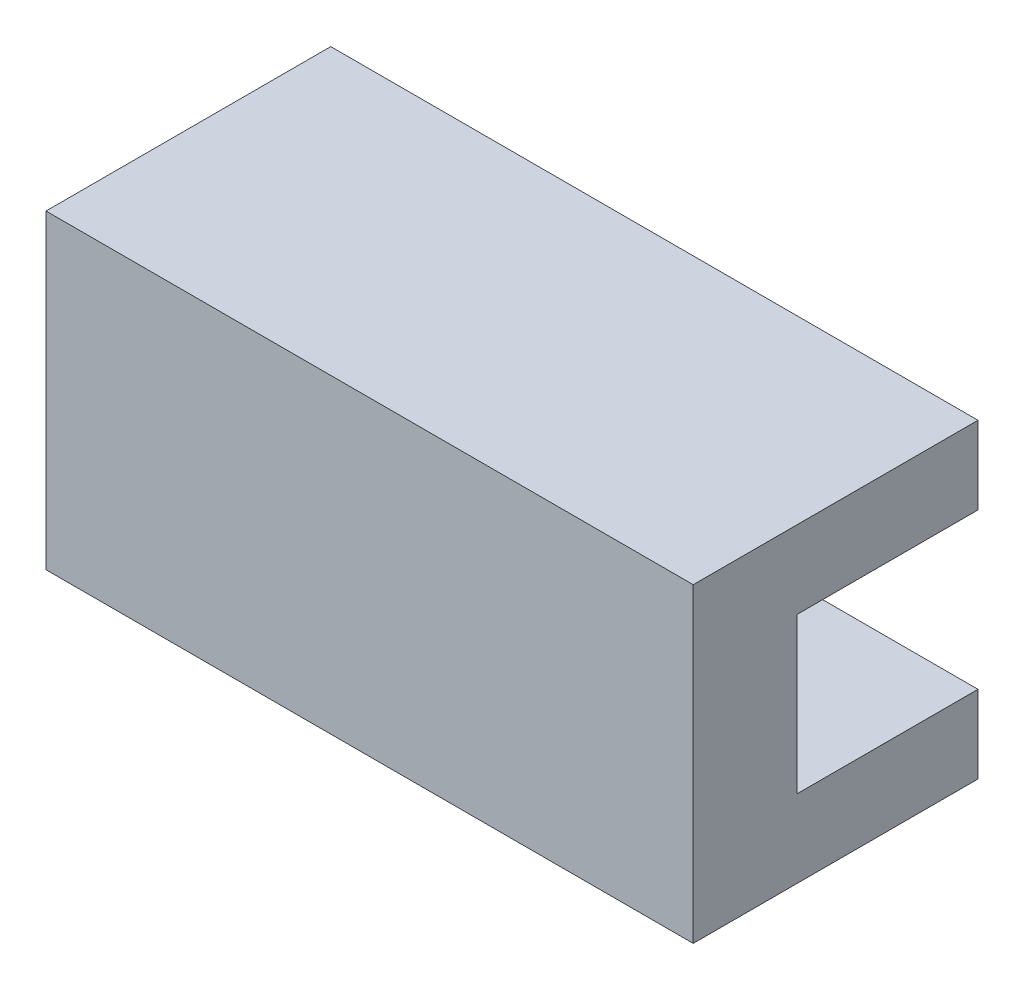
ISO-10303-21;
HEADER;
FILE_DESCRIPTION(('STEP AP214'),'2;1');
FILE_NAME('part.step','',(''),(''),'','','');
FILE_SCHEMA(('AUTOMOTIVE_DESIGN { 1 0 10303 214 1 1 1 1 }'));
ENDSEC;
DATA;
#1=APPLICATION_CONTEXT('core data for automotive mechanical design processes');
#2=APPLICATION_PROTOCOL_DEFINITION('international standard','automotive_design',2000,#1);
#3=PRODUCT_CONTEXT('',#1,'mechanical');
#4=PRODUCT('Part','Part','',(#3));
#5=PRODUCT_RELATED_PRODUCT_CATEGORY('part','',(#4));
#6=PRODUCT_DEFINITION_FORMATION('','',#4);
#7=PRODUCT_DEFINITION_CONTEXT('part definition',#1,'design');
#8=PRODUCT_DEFINITION('design','',#6,#7);
#9=PRODUCT_DEFINITION_SHAPE('','',#8);
#10=(LENGTH_UNIT() NAMED_UNIT(*) SI_UNIT(.MILLI.,.METRE.));
#11=(NAMED_UNIT(*) PLANE_ANGLE_UNIT() SI_UNIT($,.RADIAN.));
#12=(NAMED_UNIT(*) SI_UNIT($,.STERADIAN.) SOLID_ANGLE_UNIT());
#13=UNCERTAINTY_MEASURE_WITH_UNIT(LENGTH_MEASURE(1.E-05),#10,'distance_accuracy_value','');
#14=(GEOMETRIC_REPRESENTATION_CONTEXT(3) GLOBAL_UNCERTAINTY_ASSIGNED_CONTEXT((#13)) GLOBAL_UNIT_ASSIGNED_CONTEXT((#10,
#11,#12)) REPRESENTATION_CONTEXT('',''));
#15=CARTESIAN_POINT('',(0.,0.,0.));
#16=DIRECTION('',(0.,0.,1.));
#17=DIRECTION('',(1.,0.,0.));
#18=AXIS2_PLACEMENT_3D('',#15,#16,#17);
#19=CARTESIAN_POINT('',(50.,13.6272988505747,-24.8818965517241));
#20=DIRECTION('',(0.,0.,1.));
#21=DIRECTION('',(1.,0.,0.));
#22=AXIS2_PLACEMENT_3D('',#19,#20,#21);
#23=PLANE('',#22);
#24=DIRECTION('',(0.,1.,0.));
#25=VECTOR('',#24,1.);
#26=CARTESIAN_POINT('',(0.,13.6272988505747,-24.8818965517241));
#27=LINE('',#26,#25);
#28=CARTESIAN_POINT('',(0.,13.6272988505747,-24.8818965517241));
#29=VERTEX_POINT('',#28);
#30=CARTESIAN_POINT('',(0.,19.6272988505747,-24.8818965517241));
#31=VERTEX_POINT('',#30);
#32=EDGE_CURVE('E127',#29,#31,#27,.T.);
#33=ORIENTED_EDGE('',*,*,#32,.T.);
#34=DIRECTION('',(-1.,0.,0.));
#35=VECTOR('',#34,1.);
#36=CARTESIAN_POINT('',(50.,19.6272988505747,-24.8818965517241));
#37=LINE('',#36,#35);
#38=CARTESIAN_POINT('',(50.,19.6272988505747,-24.8818965517241));
#39=VERTEX_POINT('',#38);
#40=EDGE_CURVE('E11',#39,#31,#37,.T.);
#41=ORIENTED_EDGE('',*,*,#40,.F.);
#42=DIRECTION('',(0.,1.,0.));
#43=VECTOR('',#42,1.);
#44=CARTESIAN_POINT('',(50.,13.6272988505747,-24.8818965517241));
#45=LINE('',#44,#43);
#46=CARTESIAN_POINT('',(50.,13.6272988505747,-24.8818965517241));
#47=VERTEX_POINT('',#46);
#48=EDGE_CURVE('E141',#47,#39,#45,.T.);
#49=ORIENTED_EDGE('',*,*,#48,.F.);
#50=DIRECTION('',(-1.,0.,0.));
#51=VECTOR('',#50,1.);
#52=CARTESIAN_POINT('',(50.,13.6272988505747,-24.8818965517241));
#53=LINE('',#52,#51);
#54=EDGE_CURVE('E123',#47,#29,#53,.T.);
#55=ORIENTED_EDGE('',*,*,#54,.T.);
#56=EDGE_LOOP('',(#33,#41,#49,#55));
#57=FACE_BOUND('',#56,.T.);
#58=ADVANCED_FACE('F31',(#57),#23,.F.);
#59=CARTESIAN_POINT('',(50.,19.6272988505747,-24.8818965517241));
#60=DIRECTION('',(0.,-1.,0.));
#61=DIRECTION('',(0.,0.,-1.));
#62=AXIS2_PLACEMENT_3D('',#59,#60,#61);
#63=PLANE('',#62);
#64=DIRECTION('',(0.,0.,1.));
#65=VECTOR('',#64,1.);
#66=CARTESIAN_POINT('',(0.,19.6272988505747,-24.8818965517241));
#67=LINE('',#66,#65);
#68=CARTESIAN_POINT('',(0.,19.6272988505747,-2.88189655172412));
#69=VERTEX_POINT('',#68);
#70=EDGE_CURVE('E130',#31,#69,#67,.T.);
#71=ORIENTED_EDGE('',*,*,#70,.T.);
#72=DIRECTION('',(-1.,0.,0.));
#73=VECTOR('',#72,1.);
#74=CARTESIAN_POINT('',(50.,19.6272988505747,-2.88189655172412));
#75=LINE('',#74,#73);
#76=CARTESIAN_POINT('',(50.,19.6272988505747,-2.88189655172412));
#77=VERTEX_POINT('',#76);
#78=EDGE_CURVE('E39',#77,#69,#75,.T.);
#79=ORIENTED_EDGE('',*,*,#78,.F.);
#80=DIRECTION('',(0.,0.,1.));
#81=VECTOR('',#80,1.);
#82=CARTESIAN_POINT('',(50.,19.6272988505747,-24.8818965517241));
#83=LINE('',#82,#81);
#84=EDGE_CURVE('E90',#39,#77,#83,.T.);
#85=ORIENTED_EDGE('',*,*,#84,.F.);
#86=ORIENTED_EDGE('',*,*,#40,.T.);
#87=EDGE_LOOP('',(#71,#79,#85,#86));
#88=FACE_BOUND('',#87,.T.);
#89=ADVANCED_FACE('F176',(#88),#63,.F.);
#90=CARTESIAN_POINT('',(50.,19.6272988505747,-2.88189655172412));
#91=DIRECTION('',(0.,0.,-1.));
#92=DIRECTION('',(0.,1.,0.));
#93=AXIS2_PLACEMENT_3D('',#90,#91,#92);
#94=PLANE('',#93);
#95=DIRECTION('',(0.,-1.,0.));
#96=VECTOR('',#95,1.);
#97=CARTESIAN_POINT('',(0.,19.6272988505747,-2.88189655172412));
#98=LINE('',#97,#96);
#99=CARTESIAN_POINT('',(0.,-4.37270114942529,-2.88189655172413));
#100=VERTEX_POINT('',#99);
#101=EDGE_CURVE('E132',#69,#100,#98,.T.);
#102=ORIENTED_EDGE('',*,*,#101,.T.);
#103=DIRECTION('',(-1.,0.,0.));
#104=VECTOR('',#103,1.);
#105=CARTESIAN_POINT('',(50.,-4.37270114942529,-2.88189655172413));
#106=LINE('',#105,#104);
#107=CARTESIAN_POINT('',(50.,-4.37270114942529,-2.88189655172413));
#108=VERTEX_POINT('',#107);
#109=EDGE_CURVE('E148',#108,#100,#106,.T.);
#110=ORIENTED_EDGE('',*,*,#109,.F.);
#111=DIRECTION('',(0.,-1.,0.));
#112=VECTOR('',#111,1.);
#113=CARTESIAN_POINT('',(50.,19.6272988505747,-2.88189655172412));
#114=LINE('',#113,#112);
#115=EDGE_CURVE('E156',#77,#108,#114,.T.);
#116=ORIENTED_EDGE('',*,*,#115,.F.);
#117=ORIENTED_EDGE('',*,*,#78,.T.);
#118=EDGE_LOOP('',(#102,#110,#116,#117));
#119=FACE_BOUND('',#118,.T.);
#120=ADVANCED_FACE('F154',(#119),#94,.F.);
#121=CARTESIAN_POINT('',(50.,-4.37270114942529,-2.88189655172413));
#122=DIRECTION('',(0.,1.,0.));
#123=DIRECTION('',(0.,0.,1.));
#124=AXIS2_PLACEMENT_3D('',#121,#122,#123);
#125=PLANE('',#124);
#126=DIRECTION('',(0.,0.,-1.));
#127=VECTOR('',#126,1.);
#128=CARTESIAN_POINT('',(0.,-4.37270114942529,-2.88189655172413));
#129=LINE('',#128,#127);
#130=CARTESIAN_POINT('',(0.,-4.37270114942529,-24.8818965517241));
#131=VERTEX_POINT('',#130);
#132=EDGE_CURVE('E134',#100,#131,#129,.T.);
#133=ORIENTED_EDGE('',*,*,#132,.T.);
#134=DIRECTION('',(-1.,0.,0.));
#135=VECTOR('',#134,1.);
#136=CARTESIAN_POINT('',(50.,-4.37270114942529,-24.8818965517241));
#137=LINE('',#136,#135);
#138=CARTESIAN_POINT('',(50.,-4.37270114942529,-24.8818965517241));
#139=VERTEX_POINT('',#138);
#140=EDGE_CURVE('E145',#139,#131,#137,.T.);
#141=ORIENTED_EDGE('',*,*,#140,.F.);
#142=DIRECTION('',(0.,0.,-1.));
#143=VECTOR('',#142,1.);
#144=CARTESIAN_POINT('',(50.,-4.37270114942529,-2.88189655172413));
#145=LINE('',#144,#143);
#146=EDGE_CURVE('E168',#108,#139,#145,.T.);
#147=ORIENTED_EDGE('',*,*,#146,.F.);
#148=ORIENTED_EDGE('',*,*,#109,.T.);
#149=EDGE_LOOP('',(#133,#141,#147,#148));
#150=FACE_BOUND('',#149,.T.);
#151=ADVANCED_FACE('F164',(#150),#125,.F.);
#152=CARTESIAN_POINT('',(50.,-4.37270114942529,-24.8818965517241));
#153=DIRECTION('',(0.,0.,1.));
#154=DIRECTION('',(1.,0.,0.));
#155=AXIS2_PLACEMENT_3D('',#152,#153,#154);
#156=PLANE('',#155);
#157=DIRECTION('',(0.,1.,0.));
#158=VECTOR('',#157,1.);
#159=CARTESIAN_POINT('',(0.,-4.37270114942529,-24.8818965517241));
#160=LINE('',#159,#158);
#161=CARTESIAN_POINT('',(0.,1.62729885057471,-24.8818965517241));
#162=VERTEX_POINT('',#161);
#163=EDGE_CURVE('E136',#131,#162,#160,.T.);
#164=ORIENTED_EDGE('',*,*,#163,.T.);
#165=DIRECTION('',(-1.,0.,0.));
#166=VECTOR('',#165,1.);
#167=CARTESIAN_POINT('',(50.,1.62729885057471,-24.8818965517241));
#168=LINE('',#167,#166);
#169=CARTESIAN_POINT('',(50.,1.62729885057471,-24.8818965517241));
#170=VERTEX_POINT('',#169);
#171=EDGE_CURVE('E118',#170,#162,#168,.T.);
#172=ORIENTED_EDGE('',*,*,#171,.F.);
#173=DIRECTION('',(0.,1.,0.));
#174=VECTOR('',#173,1.);
#175=CARTESIAN_POINT('',(50.,-4.37270114942529,-24.8818965517241));
#176=LINE('',#175,#174);
#177=EDGE_CURVE('E109',#139,#170,#176,.T.);
#178=ORIENTED_EDGE('',*,*,#177,.F.);
#179=ORIENTED_EDGE('',*,*,#140,.T.);
#180=EDGE_LOOP('',(#164,#172,#178,#179));
#181=FACE_BOUND('',#180,.T.);
#182=ADVANCED_FACE('F167',(#181),#156,.F.);
#183=CARTESIAN_POINT('',(50.,1.62729885057471,-24.8818965517241));
#184=DIRECTION('',(0.,-1.,0.));
#185=DIRECTION('',(0.,0.,-1.));
#186=AXIS2_PLACEMENT_3D('',#183,#184,#185);
#187=PLANE('',#186);
#188=DIRECTION('',(0.,0.,1.));
#189=VECTOR('',#188,1.);
#190=CARTESIAN_POINT('',(0.,1.62729885057471,-24.8818965517241));
#191=LINE('',#190,#189);
#192=CARTESIAN_POINT('',(0.,1.6272988505747,-10.8818965517241));
#193=VERTEX_POINT('',#192);
#194=EDGE_CURVE('E117',#162,#193,#191,.T.);
#195=ORIENTED_EDGE('',*,*,#194,.T.);
#196=DIRECTION('',(-1.,0.,0.));
#197=VECTOR('',#196,1.);
#198=CARTESIAN_POINT('',(50.,1.6272988505747,-10.8818965517241));
#199=LINE('',#198,#197);
#200=CARTESIAN_POINT('',(50.,1.6272988505747,-10.8818965517241));
#201=VERTEX_POINT('',#200);
#202=EDGE_CURVE('E114',#201,#193,#199,.T.);
#203=ORIENTED_EDGE('',*,*,#202,.F.);
#204=DIRECTION('',(0.,0.,1.));
#205=VECTOR('',#204,1.);
#206=CARTESIAN_POINT('',(50.,1.62729885057471,-24.8818965517241));
#207=LINE('',#206,#205);
#208=EDGE_CURVE('E103',#170,#201,#207,.T.);
#209=ORIENTED_EDGE('',*,*,#208,.F.);
#210=ORIENTED_EDGE('',*,*,#171,.T.);
#211=EDGE_LOOP('',(#195,#203,#209,#210));
#212=FACE_BOUND('',#211,.T.);
#213=ADVANCED_FACE('F115',(#212),#187,.F.);
#214=CARTESIAN_POINT('',(50.,1.6272988505747,-10.8818965517241));
#215=DIRECTION('',(0.,0.,1.));
#216=DIRECTION('',(1.,0.,0.));
#217=AXIS2_PLACEMENT_3D('',#214,#215,#216);
#218=PLANE('',#217);
#219=DIRECTION('',(0.,1.,0.));
#220=VECTOR('',#219,1.);
#221=CARTESIAN_POINT('',(0.,1.6272988505747,-10.8818965517241));
#222=LINE('',#221,#220);
#223=CARTESIAN_POINT('',(0.,13.6272988505747,-10.8818965517241));
#224=VERTEX_POINT('',#223);
#225=EDGE_CURVE('E76',#193,#224,#222,.T.);
#226=ORIENTED_EDGE('',*,*,#225,.T.);
#227=DIRECTION('',(-1.,0.,0.));
#228=VECTOR('',#227,1.);
#229=CARTESIAN_POINT('',(50.,13.6272988505747,-10.8818965517241));
#230=LINE('',#229,#228);
#231=CARTESIAN_POINT('',(50.,13.6272988505747,-10.8818965517241));
#232=VERTEX_POINT('',#231);
#233=EDGE_CURVE('E119',#232,#224,#230,.T.);
#234=ORIENTED_EDGE('',*,*,#233,.F.);
#235=DIRECTION('',(0.,1.,0.));
#236=VECTOR('',#235,1.);
#237=CARTESIAN_POINT('',(50.,1.6272988505747,-10.8818965517241));
#238=LINE('',#237,#236);
#239=EDGE_CURVE('E107',#201,#232,#238,.T.);
#240=ORIENTED_EDGE('',*,*,#239,.F.);
#241=ORIENTED_EDGE('',*,*,#202,.T.);
#242=EDGE_LOOP('',(#226,#234,#240,#241));
#243=FACE_BOUND('',#242,.T.);
#244=ADVANCED_FACE('F121',(#243),#218,.F.);
#245=CARTESIAN_POINT('',(50.,13.6272988505747,-10.8818965517241));
#246=DIRECTION('',(0.,1.,0.));
#247=DIRECTION('',(0.,0.,1.));
#248=AXIS2_PLACEMENT_3D('',#245,#246,#247);
#249=PLANE('',#248);
#250=DIRECTION('',(0.,0.,-1.));
#251=VECTOR('',#250,1.);
#252=CARTESIAN_POINT('',(0.,13.6272988505747,-10.8818965517241));
#253=LINE('',#252,#251);
#254=EDGE_CURVE('E82',#224,#29,#253,.T.);
#255=ORIENTED_EDGE('',*,*,#254,.T.);
#256=ORIENTED_EDGE('',*,*,#54,.F.);
#257=DIRECTION('',(0.,0.,-1.));
#258=VECTOR('',#257,1.);
#259=CARTESIAN_POINT('',(50.,13.6272988505747,-10.8818965517241));
#260=LINE('',#259,#258);
#261=EDGE_CURVE('E47',#232,#47,#260,.T.);
#262=ORIENTED_EDGE('',*,*,#261,.F.);
#263=ORIENTED_EDGE('',*,*,#233,.T.);
#264=EDGE_LOOP('',(#255,#256,#262,#263));
#265=FACE_BOUND('',#264,.T.);
#266=ADVANCED_FACE('F192',(#265),#249,.F.);
#267=CARTESIAN_POINT('',(50.,-4.37270114942529,-24.8818965517241));
#268=DIRECTION('',(-1.,0.,0.));
#269=DIRECTION('',(0.,0.,1.));
#270=AXIS2_PLACEMENT_3D('',#267,#268,#269);
#271=PLANE('',#270);
#272=ORIENTED_EDGE('',*,*,#48,.T.);
#273=ORIENTED_EDGE('',*,*,#84,.T.);
#274=ORIENTED_EDGE('',*,*,#115,.T.);
#275=ORIENTED_EDGE('',*,*,#146,.T.);
#276=ORIENTED_EDGE('',*,*,#177,.T.);
#277=ORIENTED_EDGE('',*,*,#208,.T.);
#278=ORIENTED_EDGE('',*,*,#239,.T.);
#279=ORIENTED_EDGE('',*,*,#261,.T.);
#280=EDGE_LOOP('',(#272,#273,#274,#275,#276,#277,#278,#279));
#281=FACE_BOUND('',#280,.T.);
#282=ADVANCED_FACE('F105',(#281),#271,.F.);
#283=CARTESIAN_POINT('',(0.,-4.37270114942529,-24.8818965517241));
#284=DIRECTION('',(-1.,0.,0.));
#285=DIRECTION('',(0.,0.,1.));
#286=AXIS2_PLACEMENT_3D('',#283,#284,#285);
#287=PLANE('',#286);
#288=ORIENTED_EDGE('',*,*,#32,.F.);
#289=ORIENTED_EDGE('',*,*,#254,.F.);
#290=ORIENTED_EDGE('',*,*,#225,.F.);
#291=ORIENTED_EDGE('',*,*,#194,.F.);
#292=ORIENTED_EDGE('',*,*,#163,.F.);
#293=ORIENTED_EDGE('',*,*,#132,.F.);
#294=ORIENTED_EDGE('',*,*,#101,.F.);
#295=ORIENTED_EDGE('',*,*,#70,.F.);
#296=EDGE_LOOP('',(#288,#289,#290,#291,#292,#293,#294,#295));
#297=FACE_BOUND('',#296,.T.);
#298=ADVANCED_FACE('F160',(#297),#287,.T.);
#299=CLOSED_SHELL('',(#58,#89,#120,#151,#182,#213,#244,#266,#282,#298));
#300=MANIFOLD_SOLID_BREP('B2',#299);
#301=ADVANCED_BREP_SHAPE_REPRESENTATION('',(#18,#300),#14);
#302=SHAPE_DEFINITION_REPRESENTATION(#9,#301);
ENDSEC;
END-ISO-10303-21;
